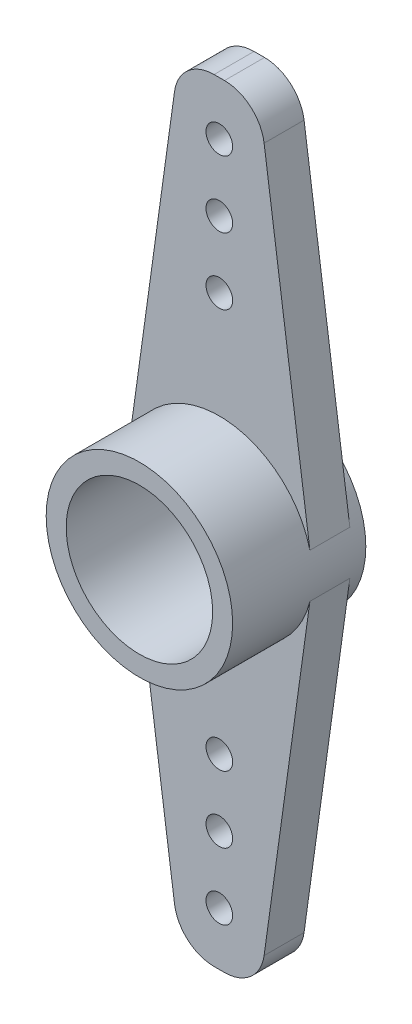
ISO-10303-21;
HEADER;
FILE_DESCRIPTION(('STEP AP214'),'2;1');
FILE_NAME('part.step','',(''),(''),'','','');
FILE_SCHEMA(('AUTOMOTIVE_DESIGN { 1 0 10303 214 1 1 1 1 }'));
ENDSEC;
DATA;
#1=APPLICATION_CONTEXT('core data for automotive mechanical design processes');
#2=APPLICATION_PROTOCOL_DEFINITION('international standard','automotive_design',2000,#1);
#3=PRODUCT_CONTEXT('',#1,'mechanical');
#4=PRODUCT('Part','Part','',(#3));
#5=PRODUCT_RELATED_PRODUCT_CATEGORY('part','',(#4));
#6=PRODUCT_DEFINITION_FORMATION('','',#4);
#7=PRODUCT_DEFINITION_CONTEXT('part definition',#1,'design');
#8=PRODUCT_DEFINITION('design','',#6,#7);
#9=PRODUCT_DEFINITION_SHAPE('','',#8);
#10=(LENGTH_UNIT() NAMED_UNIT(*) SI_UNIT(.MILLI.,.METRE.));
#11=(NAMED_UNIT(*) PLANE_ANGLE_UNIT() SI_UNIT($,.RADIAN.));
#12=(NAMED_UNIT(*) SI_UNIT($,.STERADIAN.) SOLID_ANGLE_UNIT());
#13=UNCERTAINTY_MEASURE_WITH_UNIT(LENGTH_MEASURE(1.E-05),#10,'distance_accuracy_value','');
#14=(GEOMETRIC_REPRESENTATION_CONTEXT(3) GLOBAL_UNCERTAINTY_ASSIGNED_CONTEXT((#13)) GLOBAL_UNIT_ASSIGNED_CONTEXT((#10,
#11,#12)) REPRESENTATION_CONTEXT('',''));
#15=CARTESIAN_POINT('',(0.,0.,0.));
#16=DIRECTION('',(0.,0.,1.));
#17=DIRECTION('',(1.,0.,0.));
#18=AXIS2_PLACEMENT_3D('',#15,#16,#17);
#19=CARTESIAN_POINT('',(0.,0.,1.5));
#20=DIRECTION('',(0.,0.,-1.));
#21=DIRECTION('',(-1.,0.,0.));
#22=AXIS2_PLACEMENT_3D('',#19,#20,#21);
#23=CYLINDRICAL_SURFACE('',#22,1.5);
#24=CARTESIAN_POINT('',(0.,0.,0.));
#25=DIRECTION('',(0.,0.,1.));
#26=DIRECTION('',(1.,0.,0.));
#27=AXIS2_PLACEMENT_3D('',#24,#25,#26);
#28=CIRCLE('',#27,1.5);
#29=CARTESIAN_POINT('',(1.5,0.,0.));
#30=VERTEX_POINT('',#29);
#31=EDGE_CURVE('E147',#30,#30,#28,.T.);
#32=ORIENTED_EDGE('',*,*,#31,.F.);
#33=EDGE_LOOP('',(#32));
#34=FACE_BOUND('',#33,.T.);
#35=CARTESIAN_POINT('',(0.,0.,0.5));
#36=DIRECTION('',(0.,0.,1.));
#37=DIRECTION('',(1.,0.,0.));
#38=AXIS2_PLACEMENT_3D('',#35,#36,#37);
#39=CIRCLE('',#38,1.5);
#40=CARTESIAN_POINT('',(1.5,0.,0.5));
#41=VERTEX_POINT('',#40);
#42=EDGE_CURVE('E37',#41,#41,#39,.T.);
#43=ORIENTED_EDGE('',*,*,#42,.T.);
#44=EDGE_LOOP('',(#43));
#45=FACE_BOUND('',#44,.T.);
#46=ADVANCED_FACE('F33',(#34,#45),#23,.F.);
#47=CARTESIAN_POINT('',(0.,0.,0.));
#48=DIRECTION('',(0.,0.,1.));
#49=DIRECTION('',(1.,0.,0.));
#50=AXIS2_PLACEMENT_3D('',#47,#48,#49);
#51=PLANE('',#50);
#52=ORIENTED_EDGE('',*,*,#31,.T.);
#53=EDGE_LOOP('',(#52));
#54=FACE_BOUND('',#53,.T.);
#55=CARTESIAN_POINT('',(0.,0.,0.));
#56=DIRECTION('',(0.,0.,-1.));
#57=DIRECTION('',(-1.,0.,0.));
#58=AXIS2_PLACEMENT_3D('',#55,#56,#57);
#59=CIRCLE('',#58,3.25);
#60=CARTESIAN_POINT('',(-3.25,0.,0.));
#61=VERTEX_POINT('',#60);
#62=EDGE_CURVE('E213',#61,#61,#59,.T.);
#63=ORIENTED_EDGE('',*,*,#62,.T.);
#64=EDGE_LOOP('',(#63));
#65=FACE_BOUND('',#64,.T.);
#66=ADVANCED_FACE('F240',(#54,#65),#51,.F.);
#67=CARTESIAN_POINT('',(0.,0.,-0.5));
#68=DIRECTION('',(0.,0.,-1.));
#69=DIRECTION('',(-1.,0.,0.));
#70=AXIS2_PLACEMENT_3D('',#67,#68,#69);
#71=PLANE('',#70);
#72=CARTESIAN_POINT('',(0.,0.,-0.5));
#73=DIRECTION('',(0.,0.,-1.));
#74=DIRECTION('',(-1.,0.,0.));
#75=AXIS2_PLACEMENT_3D('',#72,#73,#74);
#76=CIRCLE('',#75,3.5);
#77=CARTESIAN_POINT('',(-3.5,0.,-0.5));
#78=VERTEX_POINT('',#77);
#79=EDGE_CURVE('E201',#78,#78,#76,.T.);
#80=ORIENTED_EDGE('',*,*,#79,.T.);
#81=EDGE_LOOP('',(#80));
#82=FACE_BOUND('',#81,.T.);
#83=CARTESIAN_POINT('',(0.,0.,-0.5));
#84=DIRECTION('',(0.,0.,-1.));
#85=DIRECTION('',(-1.,0.,0.));
#86=AXIS2_PLACEMENT_3D('',#83,#84,#85);
#87=CIRCLE('',#86,3.25);
#88=CARTESIAN_POINT('',(-3.25,0.,-0.5));
#89=VERTEX_POINT('',#88);
#90=EDGE_CURVE('E211',#89,#89,#87,.T.);
#91=ORIENTED_EDGE('',*,*,#90,.F.);
#92=EDGE_LOOP('',(#91));
#93=FACE_BOUND('',#92,.T.);
#94=ADVANCED_FACE('F246',(#82,#93),#71,.T.);
#95=CARTESIAN_POINT('',(0.,0.,-0.5));
#96=DIRECTION('',(0.,0.,1.));
#97=DIRECTION('',(1.,0.,0.));
#98=AXIS2_PLACEMENT_3D('',#95,#96,#97);
#99=CYLINDRICAL_SURFACE('',#98,3.25);
#100=ORIENTED_EDGE('',*,*,#90,.T.);
#101=EDGE_LOOP('',(#100));
#102=FACE_BOUND('',#101,.T.);
#103=ORIENTED_EDGE('',*,*,#62,.F.);
#104=EDGE_LOOP('',(#103));
#105=FACE_BOUND('',#104,.T.);
#106=ADVANCED_FACE('F391',(#102,#105),#99,.F.);
#107=CARTESIAN_POINT('',(0.,10.,1.5));
#108=DIRECTION('',(0.,0.,-1.));
#109=DIRECTION('',(-1.,0.,0.));
#110=AXIS2_PLACEMENT_3D('',#107,#108,#109);
#111=CYLINDRICAL_SURFACE('',#110,0.5);
#112=CARTESIAN_POINT('',(0.,10.,1.5));
#113=DIRECTION('',(0.,0.,1.));
#114=DIRECTION('',(1.,0.,0.));
#115=AXIS2_PLACEMENT_3D('',#112,#113,#114);
#116=CIRCLE('',#115,0.5);
#117=CARTESIAN_POINT('',(0.5,10.,1.5));
#118=VERTEX_POINT('',#117);
#119=EDGE_CURVE('E334',#118,#118,#116,.T.);
#120=ORIENTED_EDGE('',*,*,#119,.T.);
#121=EDGE_LOOP('',(#120));
#122=FACE_BOUND('',#121,.T.);
#123=CARTESIAN_POINT('',(0.,10.,0.));
#124=DIRECTION('',(0.,0.,1.));
#125=DIRECTION('',(1.,0.,0.));
#126=AXIS2_PLACEMENT_3D('',#123,#124,#125);
#127=CIRCLE('',#126,0.5);
#128=CARTESIAN_POINT('',(0.5,10.,0.));
#129=VERTEX_POINT('',#128);
#130=EDGE_CURVE('E335',#129,#129,#127,.T.);
#131=ORIENTED_EDGE('',*,*,#130,.F.);
#132=EDGE_LOOP('',(#131));
#133=FACE_BOUND('',#132,.T.);
#134=ADVANCED_FACE('F254',(#122,#133),#111,.F.);
#135=CARTESIAN_POINT('',(0.,12.5,1.5));
#136=DIRECTION('',(0.,0.,-1.));
#137=DIRECTION('',(-1.,0.,0.));
#138=AXIS2_PLACEMENT_3D('',#135,#136,#137);
#139=CYLINDRICAL_SURFACE('',#138,0.5);
#140=CARTESIAN_POINT('',(0.,12.5,1.5));
#141=DIRECTION('',(0.,0.,1.));
#142=DIRECTION('',(1.,0.,0.));
#143=AXIS2_PLACEMENT_3D('',#140,#141,#142);
#144=CIRCLE('',#143,0.5);
#145=CARTESIAN_POINT('',(0.5,12.5,1.5));
#146=VERTEX_POINT('',#145);
#147=EDGE_CURVE('E338',#146,#146,#144,.T.);
#148=ORIENTED_EDGE('',*,*,#147,.T.);
#149=EDGE_LOOP('',(#148));
#150=FACE_BOUND('',#149,.T.);
#151=CARTESIAN_POINT('',(0.,12.5,0.));
#152=DIRECTION('',(0.,0.,1.));
#153=DIRECTION('',(1.,0.,0.));
#154=AXIS2_PLACEMENT_3D('',#151,#152,#153);
#155=CIRCLE('',#154,0.5);
#156=CARTESIAN_POINT('',(0.5,12.5,0.));
#157=VERTEX_POINT('',#156);
#158=EDGE_CURVE('E341',#157,#157,#155,.T.);
#159=ORIENTED_EDGE('',*,*,#158,.F.);
#160=EDGE_LOOP('',(#159));
#161=FACE_BOUND('',#160,.T.);
#162=ADVANCED_FACE('F384',(#150,#161),#139,.F.);
#163=CARTESIAN_POINT('',(0.,7.5,1.5));
#164=DIRECTION('',(0.,0.,-1.));
#165=DIRECTION('',(-1.,0.,0.));
#166=AXIS2_PLACEMENT_3D('',#163,#164,#165);
#167=CYLINDRICAL_SURFACE('',#166,0.5);
#168=CARTESIAN_POINT('',(0.,7.5,1.5));
#169=DIRECTION('',(0.,0.,1.));
#170=DIRECTION('',(1.,0.,0.));
#171=AXIS2_PLACEMENT_3D('',#168,#169,#170);
#172=CIRCLE('',#171,0.5);
#173=CARTESIAN_POINT('',(0.5,7.5,1.5));
#174=VERTEX_POINT('',#173);
#175=EDGE_CURVE('E344',#174,#174,#172,.T.);
#176=ORIENTED_EDGE('',*,*,#175,.T.);
#177=EDGE_LOOP('',(#176));
#178=FACE_BOUND('',#177,.T.);
#179=CARTESIAN_POINT('',(0.,7.5,0.));
#180=DIRECTION('',(0.,0.,1.));
#181=DIRECTION('',(1.,0.,0.));
#182=AXIS2_PLACEMENT_3D('',#179,#180,#181);
#183=CIRCLE('',#182,0.5);
#184=CARTESIAN_POINT('',(0.5,7.5,0.));
#185=VERTEX_POINT('',#184);
#186=EDGE_CURVE('E347',#185,#185,#183,.T.);
#187=ORIENTED_EDGE('',*,*,#186,.F.);
#188=EDGE_LOOP('',(#187));
#189=FACE_BOUND('',#188,.T.);
#190=ADVANCED_FACE('F274',(#178,#189),#167,.F.);
#191=CARTESIAN_POINT('',(0.196011828683711,13.,1.5));
#192=DIRECTION('',(0.,0.,-1.));
#193=DIRECTION('',(-1.,0.,0.));
#194=AXIS2_PLACEMENT_3D('',#191,#192,#193);
#195=CYLINDRICAL_SURFACE('',#194,1.5);
#196=CARTESIAN_POINT('',(0.196011828683711,13.,0.));
#197=DIRECTION('',(0.,0.,1.));
#198=DIRECTION('',(1.,0.,0.));
#199=AXIS2_PLACEMENT_3D('',#196,#197,#198);
#200=CIRCLE('',#199,1.5);
#201=CARTESIAN_POINT('',(1.68175998809153,13.206282347321,0.));
#202=VERTEX_POINT('',#201);
#203=CARTESIAN_POINT('',(0.196011828683702,14.5,0.));
#204=VERTEX_POINT('',#203);
#205=EDGE_CURVE('E158',#202,#204,#200,.T.);
#206=ORIENTED_EDGE('',*,*,#205,.T.);
#207=DIRECTION('',(0.,0.,-1.));
#208=VECTOR('',#207,1.);
#209=CARTESIAN_POINT('',(0.196011828683702,14.5,1.5));
#210=LINE('',#209,#208);
#211=CARTESIAN_POINT('',(0.196011828683702,14.5,1.5));
#212=VERTEX_POINT('',#211);
#213=EDGE_CURVE('E135',#212,#204,#210,.T.);
#214=ORIENTED_EDGE('',*,*,#213,.F.);
#215=CARTESIAN_POINT('',(0.196011828683711,13.,1.5));
#216=DIRECTION('',(0.,0.,1.));
#217=DIRECTION('',(1.,0.,0.));
#218=AXIS2_PLACEMENT_3D('',#215,#216,#217);
#219=CIRCLE('',#218,1.5);
#220=CARTESIAN_POINT('',(1.68175998809153,13.206282347321,1.5));
#221=VERTEX_POINT('',#220);
#222=EDGE_CURVE('E130',#221,#212,#219,.T.);
#223=ORIENTED_EDGE('',*,*,#222,.F.);
#224=DIRECTION('',(0.,0.,-1.));
#225=VECTOR('',#224,1.);
#226=CARTESIAN_POINT('',(1.68175998809153,13.206282347321,1.5));
#227=LINE('',#226,#225);
#228=EDGE_CURVE('E170',#221,#202,#227,.T.);
#229=ORIENTED_EDGE('',*,*,#228,.T.);
#230=EDGE_LOOP('',(#206,#214,#223,#229));
#231=FACE_BOUND('',#230,.T.);
#232=ADVANCED_FACE('F271',(#231),#195,.T.);
#233=CARTESIAN_POINT('',(-0.196011828683702,14.5,1.5));
#234=DIRECTION('',(0.,-1.,0.));
#235=DIRECTION('',(0.,0.,-1.));
#236=AXIS2_PLACEMENT_3D('',#233,#234,#235);
#237=PLANE('',#236);
#238=DIRECTION('',(-1.,0.,0.));
#239=VECTOR('',#238,1.);
#240=CARTESIAN_POINT('',(-0.196011828683702,14.5,0.));
#241=LINE('',#240,#239);
#242=CARTESIAN_POINT('',(-0.196011828683702,14.5,0.));
#243=VERTEX_POINT('',#242);
#244=EDGE_CURVE('E85',#204,#243,#241,.T.);
#245=ORIENTED_EDGE('',*,*,#244,.T.);
#246=DIRECTION('',(0.,0.,-1.));
#247=VECTOR('',#246,1.);
#248=CARTESIAN_POINT('',(-0.196011828683702,14.5,1.5));
#249=LINE('',#248,#247);
#250=CARTESIAN_POINT('',(-0.196011828683702,14.5,1.5));
#251=VERTEX_POINT('',#250);
#252=EDGE_CURVE('E133',#251,#243,#249,.T.);
#253=ORIENTED_EDGE('',*,*,#252,.F.);
#254=DIRECTION('',(-1.,0.,0.));
#255=VECTOR('',#254,1.);
#256=CARTESIAN_POINT('',(-0.196011828683702,14.5,1.5));
#257=LINE('',#256,#255);
#258=EDGE_CURVE('E124',#212,#251,#257,.T.);
#259=ORIENTED_EDGE('',*,*,#258,.F.);
#260=ORIENTED_EDGE('',*,*,#213,.T.);
#261=EDGE_LOOP('',(#245,#253,#259,#260));
#262=FACE_BOUND('',#261,.T.);
#263=ADVANCED_FACE('F134',(#262),#237,.F.);
#264=CARTESIAN_POINT('',(-0.196011828683711,13.,1.5));
#265=DIRECTION('',(0.,0.,-1.));
#266=DIRECTION('',(-1.,0.,0.));
#267=AXIS2_PLACEMENT_3D('',#264,#265,#266);
#268=CYLINDRICAL_SURFACE('',#267,1.5);
#269=CARTESIAN_POINT('',(-0.196011828683711,13.,0.));
#270=DIRECTION('',(0.,0.,1.));
#271=DIRECTION('',(1.,0.,0.));
#272=AXIS2_PLACEMENT_3D('',#269,#270,#271);
#273=CIRCLE('',#272,1.5);
#274=CARTESIAN_POINT('',(-1.68175998809153,13.206282347321,0.));
#275=VERTEX_POINT('',#274);
#276=EDGE_CURVE('E92',#243,#275,#273,.T.);
#277=ORIENTED_EDGE('',*,*,#276,.T.);
#278=DIRECTION('',(0.,0.,-1.));
#279=VECTOR('',#278,1.);
#280=CARTESIAN_POINT('',(-1.68175998809153,13.206282347321,1.5));
#281=LINE('',#280,#279);
#282=CARTESIAN_POINT('',(-1.68175998809153,13.206282347321,1.5));
#283=VERTEX_POINT('',#282);
#284=EDGE_CURVE('E136',#283,#275,#281,.T.);
#285=ORIENTED_EDGE('',*,*,#284,.F.);
#286=CARTESIAN_POINT('',(-0.196011828683711,13.,1.5));
#287=DIRECTION('',(0.,0.,1.));
#288=DIRECTION('',(1.,0.,0.));
#289=AXIS2_PLACEMENT_3D('',#286,#287,#288);
#290=CIRCLE('',#289,1.5);
#291=EDGE_CURVE('E128',#251,#283,#290,.T.);
#292=ORIENTED_EDGE('',*,*,#291,.F.);
#293=ORIENTED_EDGE('',*,*,#252,.T.);
#294=EDGE_LOOP('',(#277,#285,#292,#293));
#295=FACE_BOUND('',#294,.T.);
#296=ADVANCED_FACE('F138',(#295),#268,.T.);
#297=CARTESIAN_POINT('',(0.,-10.,1.5));
#298=DIRECTION('',(0.,0.,-1.));
#299=DIRECTION('',(-1.,0.,0.));
#300=AXIS2_PLACEMENT_3D('',#297,#298,#299);
#301=CYLINDRICAL_SURFACE('',#300,0.500000000000001);
#302=CARTESIAN_POINT('',(0.,-10.,1.5));
#303=DIRECTION('',(0.,0.,1.));
#304=DIRECTION('',(-1.,0.,0.));
#305=AXIS2_PLACEMENT_3D('',#302,#303,#304);
#306=CIRCLE('',#305,0.500000000000001);
#307=CARTESIAN_POINT('',(-0.499999999999931,-10.,1.5));
#308=VERTEX_POINT('',#307);
#309=EDGE_CURVE('E362',#308,#308,#306,.T.);
#310=ORIENTED_EDGE('',*,*,#309,.T.);
#311=EDGE_LOOP('',(#310));
#312=FACE_BOUND('',#311,.T.);
#313=CARTESIAN_POINT('',(0.,-10.,0.));
#314=DIRECTION('',(0.,0.,1.));
#315=DIRECTION('',(-1.,0.,0.));
#316=AXIS2_PLACEMENT_3D('',#313,#314,#315);
#317=CIRCLE('',#316,0.500000000000001);
#318=CARTESIAN_POINT('',(-0.499999999999931,-10.,0.));
#319=VERTEX_POINT('',#318);
#320=EDGE_CURVE('E205',#319,#319,#317,.T.);
#321=ORIENTED_EDGE('',*,*,#320,.F.);
#322=EDGE_LOOP('',(#321));
#323=FACE_BOUND('',#322,.T.);
#324=ADVANCED_FACE('F268',(#312,#323),#301,.F.);
#325=CARTESIAN_POINT('',(0.,-12.5,1.5));
#326=DIRECTION('',(0.,0.,-1.));
#327=DIRECTION('',(-1.,0.,0.));
#328=AXIS2_PLACEMENT_3D('',#325,#326,#327);
#329=CYLINDRICAL_SURFACE('',#328,0.500000000000001);
#330=CARTESIAN_POINT('',(0.,-12.5,1.5));
#331=DIRECTION('',(0.,0.,1.));
#332=DIRECTION('',(-1.,0.,0.));
#333=AXIS2_PLACEMENT_3D('',#330,#331,#332);
#334=CIRCLE('',#333,0.500000000000001);
#335=CARTESIAN_POINT('',(-0.499999999999914,-12.5,1.5));
#336=VERTEX_POINT('',#335);
#337=EDGE_CURVE('E356',#336,#336,#334,.T.);
#338=ORIENTED_EDGE('',*,*,#337,.T.);
#339=EDGE_LOOP('',(#338));
#340=FACE_BOUND('',#339,.T.);
#341=CARTESIAN_POINT('',(0.,-12.5,0.));
#342=DIRECTION('',(0.,0.,1.));
#343=DIRECTION('',(-1.,0.,0.));
#344=AXIS2_PLACEMENT_3D('',#341,#342,#343);
#345=CIRCLE('',#344,0.500000000000001);
#346=CARTESIAN_POINT('',(-0.499999999999914,-12.5,0.));
#347=VERTEX_POINT('',#346);
#348=EDGE_CURVE('E359',#347,#347,#345,.T.);
#349=ORIENTED_EDGE('',*,*,#348,.F.);
#350=EDGE_LOOP('',(#349));
#351=FACE_BOUND('',#350,.T.);
#352=ADVANCED_FACE('F300',(#340,#351),#329,.F.);
#353=CARTESIAN_POINT('',(0.,-7.50000000000003,1.5));
#354=DIRECTION('',(0.,0.,-1.));
#355=DIRECTION('',(-1.,0.,0.));
#356=AXIS2_PLACEMENT_3D('',#353,#354,#355);
#357=CYLINDRICAL_SURFACE('',#356,0.500000000000001);
#358=CARTESIAN_POINT('',(0.,-7.50000000000003,1.5));
#359=DIRECTION('',(0.,0.,1.));
#360=DIRECTION('',(-1.,0.,0.));
#361=AXIS2_PLACEMENT_3D('',#358,#359,#360);
#362=CIRCLE('',#361,0.500000000000001);
#363=CARTESIAN_POINT('',(-0.499999999999949,-7.50000000000003,1.5));
#364=VERTEX_POINT('',#363);
#365=EDGE_CURVE('E350',#364,#364,#362,.T.);
#366=ORIENTED_EDGE('',*,*,#365,.T.);
#367=EDGE_LOOP('',(#366));
#368=FACE_BOUND('',#367,.T.);
#369=CARTESIAN_POINT('',(0.,-7.50000000000003,0.));
#370=DIRECTION('',(0.,0.,1.));
#371=DIRECTION('',(-1.,0.,0.));
#372=AXIS2_PLACEMENT_3D('',#369,#370,#371);
#373=CIRCLE('',#372,0.500000000000001);
#374=CARTESIAN_POINT('',(-0.499999999999949,-7.50000000000003,0.));
#375=VERTEX_POINT('',#374);
#376=EDGE_CURVE('E353',#375,#375,#373,.T.);
#377=ORIENTED_EDGE('',*,*,#376,.F.);
#378=EDGE_LOOP('',(#377));
#379=FACE_BOUND('',#378,.T.);
#380=ADVANCED_FACE('F295',(#368,#379),#357,.F.);
#381=CARTESIAN_POINT('',(-0.19601182868362,-13.,1.5));
#382=DIRECTION('',(0.,0.,-1.));
#383=DIRECTION('',(-1.,0.,0.));
#384=AXIS2_PLACEMENT_3D('',#381,#382,#383);
#385=CYLINDRICAL_SURFACE('',#384,1.50000000000004);
#386=CARTESIAN_POINT('',(-0.19601182868362,-13.,0.));
#387=DIRECTION('',(0.,0.,1.));
#388=DIRECTION('',(-1.,0.,0.));
#389=AXIS2_PLACEMENT_3D('',#386,#387,#388);
#390=CIRCLE('',#389,1.50000000000004);
#391=CARTESIAN_POINT('',(-1.68175998809149,-13.206282347321,0.));
#392=VERTEX_POINT('',#391);
#393=CARTESIAN_POINT('',(-0.1960118286836,-14.5,0.));
#394=VERTEX_POINT('',#393);
#395=EDGE_CURVE('E146',#392,#394,#390,.T.);
#396=ORIENTED_EDGE('',*,*,#395,.T.);
#397=DIRECTION('',(0.,0.,-1.));
#398=VECTOR('',#397,1.);
#399=CARTESIAN_POINT('',(-0.1960118286836,-14.5,1.5));
#400=LINE('',#399,#398);
#401=CARTESIAN_POINT('',(-0.1960118286836,-14.5,1.5));
#402=VERTEX_POINT('',#401);
#403=EDGE_CURVE('E185',#402,#394,#400,.T.);
#404=ORIENTED_EDGE('',*,*,#403,.F.);
#405=CARTESIAN_POINT('',(-0.19601182868362,-13.,1.5));
#406=DIRECTION('',(0.,0.,1.));
#407=DIRECTION('',(-1.,0.,0.));
#408=AXIS2_PLACEMENT_3D('',#405,#406,#407);
#409=CIRCLE('',#408,1.50000000000004);
#410=CARTESIAN_POINT('',(-1.68175998809149,-13.206282347321,1.5));
#411=VERTEX_POINT('',#410);
#412=EDGE_CURVE('E329',#411,#402,#409,.T.);
#413=ORIENTED_EDGE('',*,*,#412,.F.);
#414=DIRECTION('',(0.,0.,-1.));
#415=VECTOR('',#414,1.);
#416=CARTESIAN_POINT('',(-1.68175998809149,-13.206282347321,1.5));
#417=LINE('',#416,#415);
#418=EDGE_CURVE('E188',#411,#392,#417,.T.);
#419=ORIENTED_EDGE('',*,*,#418,.T.);
#420=EDGE_LOOP('',(#396,#404,#413,#419));
#421=FACE_BOUND('',#420,.T.);
#422=ADVANCED_FACE('F292',(#421),#385,.T.);
#423=CARTESIAN_POINT('',(-0.1960118286836,-14.5,1.5));
#424=DIRECTION('',(0.,1.,0.));
#425=DIRECTION('',(0.,0.,1.));
#426=AXIS2_PLACEMENT_3D('',#423,#424,#425);
#427=PLANE('',#426);
#428=DIRECTION('',(1.,0.,0.));
#429=VECTOR('',#428,1.);
#430=CARTESIAN_POINT('',(-0.1960118286836,-14.5,0.));
#431=LINE('',#430,#429);
#432=CARTESIAN_POINT('',(0.196011828683802,-14.5,0.));
#433=VERTEX_POINT('',#432);
#434=EDGE_CURVE('E149',#394,#433,#431,.T.);
#435=ORIENTED_EDGE('',*,*,#434,.T.);
#436=DIRECTION('',(0.,0.,-1.));
#437=VECTOR('',#436,1.);
#438=CARTESIAN_POINT('',(0.196011828683802,-14.5,1.5));
#439=LINE('',#438,#437);
#440=CARTESIAN_POINT('',(0.196011828683802,-14.5,1.5));
#441=VERTEX_POINT('',#440);
#442=EDGE_CURVE('E182',#441,#433,#439,.T.);
#443=ORIENTED_EDGE('',*,*,#442,.F.);
#444=DIRECTION('',(1.,0.,0.));
#445=VECTOR('',#444,1.);
#446=CARTESIAN_POINT('',(-0.1960118286836,-14.5,1.5));
#447=LINE('',#446,#445);
#448=EDGE_CURVE('E311',#402,#441,#447,.T.);
#449=ORIENTED_EDGE('',*,*,#448,.F.);
#450=ORIENTED_EDGE('',*,*,#403,.T.);
#451=EDGE_LOOP('',(#435,#443,#449,#450));
#452=FACE_BOUND('',#451,.T.);
#453=ADVANCED_FACE('F289',(#452),#427,.F.);
#454=CARTESIAN_POINT('',(0.196011828683801,-13.,1.5));
#455=DIRECTION('',(0.,0.,-1.));
#456=DIRECTION('',(-1.,0.,0.));
#457=AXIS2_PLACEMENT_3D('',#454,#455,#456);
#458=CYLINDRICAL_SURFACE('',#457,1.49999999999995);
#459=CARTESIAN_POINT('',(0.196011828683801,-13.,0.));
#460=DIRECTION('',(0.,0.,1.));
#461=DIRECTION('',(-1.,0.,0.));
#462=AXIS2_PLACEMENT_3D('',#459,#460,#461);
#463=CIRCLE('',#462,1.49999999999995);
#464=CARTESIAN_POINT('',(1.68175998809153,-13.206282347321,0.));
#465=VERTEX_POINT('',#464);
#466=EDGE_CURVE('E151',#433,#465,#463,.T.);
#467=ORIENTED_EDGE('',*,*,#466,.T.);
#468=DIRECTION('',(0.,0.,-1.));
#469=VECTOR('',#468,1.);
#470=CARTESIAN_POINT('',(1.68175998809153,-13.206282347321,1.5));
#471=LINE('',#470,#469);
#472=CARTESIAN_POINT('',(1.68175998809153,-13.206282347321,1.5));
#473=VERTEX_POINT('',#472);
#474=EDGE_CURVE('E179',#473,#465,#471,.T.);
#475=ORIENTED_EDGE('',*,*,#474,.F.);
#476=CARTESIAN_POINT('',(0.196011828683801,-13.,1.5));
#477=DIRECTION('',(0.,0.,1.));
#478=DIRECTION('',(-1.,0.,0.));
#479=AXIS2_PLACEMENT_3D('',#476,#477,#478);
#480=CIRCLE('',#479,1.49999999999995);
#481=EDGE_CURVE('E323',#441,#473,#480,.T.);
#482=ORIENTED_EDGE('',*,*,#481,.F.);
#483=ORIENTED_EDGE('',*,*,#442,.T.);
#484=EDGE_LOOP('',(#467,#475,#482,#483));
#485=FACE_BOUND('',#484,.T.);
#486=ADVANCED_FACE('F286',(#485),#458,.T.);
#487=CARTESIAN_POINT('',(0.,0.,4.5));
#488=DIRECTION('',(0.,0.,1.));
#489=DIRECTION('',(1.,0.,0.));
#490=AXIS2_PLACEMENT_3D('',#487,#488,#489);
#491=PLANE('',#490);
#492=CARTESIAN_POINT('',(0.,0.,4.5));
#493=DIRECTION('',(0.,0.,1.));
#494=DIRECTION('',(1.,0.,0.));
#495=AXIS2_PLACEMENT_3D('',#492,#493,#494);
#496=CIRCLE('',#495,2.75);
#497=CARTESIAN_POINT('',(2.75,0.,4.5));
#498=VERTEX_POINT('',#497);
#499=EDGE_CURVE('E218',#498,#498,#496,.T.);
#500=ORIENTED_EDGE('',*,*,#499,.F.);
#501=EDGE_LOOP('',(#500));
#502=FACE_BOUND('',#501,.T.);
#503=CARTESIAN_POINT('',(0.,0.,4.5));
#504=DIRECTION('',(0.,0.,1.));
#505=DIRECTION('',(1.,0.,0.));
#506=AXIS2_PLACEMENT_3D('',#503,#504,#505);
#507=CIRCLE('',#506,3.5);
#508=CARTESIAN_POINT('',(3.5,0.,4.5));
#509=VERTEX_POINT('',#508);
#510=EDGE_CURVE('E200',#509,#509,#507,.T.);
#511=ORIENTED_EDGE('',*,*,#510,.T.);
#512=EDGE_LOOP('',(#511));
#513=FACE_BOUND('',#512,.T.);
#514=ADVANCED_FACE('F284',(#502,#513),#491,.T.);
#515=CARTESIAN_POINT('',(3.4,-0.830662386291809,1.5));
#516=DIRECTION('',(-0.990498772938549,0.137521564880675,0.));
#517=DIRECTION('',(-0.137521564880675,-0.990498772938549,0.));
#518=AXIS2_PLACEMENT_3D('',#515,#516,#517);
#519=PLANE('',#518);
#520=DIRECTION('',(0.137521564880675,0.990498772938548,0.));
#521=VECTOR('',#520,1.);
#522=CARTESIAN_POINT('',(3.4,-0.830662386291809,0.));
#523=LINE('',#522,#521);
#524=CARTESIAN_POINT('',(3.4,-0.83066238629181,0.));
#525=VERTEX_POINT('',#524);
#526=EDGE_CURVE('E153',#465,#525,#523,.T.);
#527=ORIENTED_EDGE('',*,*,#526,.T.);
#528=DIRECTION('',(0.,0.,-1.));
#529=VECTOR('',#528,1.);
#530=CARTESIAN_POINT('',(3.4,-0.83066238629181,1.5));
#531=LINE('',#530,#529);
#532=CARTESIAN_POINT('',(3.4,-0.83066238629181,1.5));
#533=VERTEX_POINT('',#532);
#534=EDGE_CURVE('E176',#533,#525,#531,.T.);
#535=ORIENTED_EDGE('',*,*,#534,.F.);
#536=DIRECTION('',(0.137521564880675,0.990498772938548,0.));
#537=VECTOR('',#536,1.);
#538=CARTESIAN_POINT('',(3.4,-0.830662386291809,1.5));
#539=LINE('',#538,#537);
#540=EDGE_CURVE('E321',#473,#533,#539,.T.);
#541=ORIENTED_EDGE('',*,*,#540,.F.);
#542=ORIENTED_EDGE('',*,*,#474,.T.);
#543=EDGE_LOOP('',(#527,#535,#541,#542));
#544=FACE_BOUND('',#543,.T.);
#545=ADVANCED_FACE('F258',(#544),#519,.F.);
#546=CARTESIAN_POINT('',(0.,0.,1.5));
#547=DIRECTION('',(0.,0.,1.));
#548=DIRECTION('',(1.,0.,0.));
#549=AXIS2_PLACEMENT_3D('',#546,#547,#548);
#550=PLANE('',#549);
#551=CARTESIAN_POINT('',(0.,0.,1.5));
#552=DIRECTION('',(0.,0.,1.));
#553=DIRECTION('',(1.,0.,0.));
#554=AXIS2_PLACEMENT_3D('',#551,#552,#553);
#555=CIRCLE('',#554,3.5);
#556=CARTESIAN_POINT('',(-3.4,-0.830662386291809,1.5));
#557=VERTEX_POINT('',#556);
#558=EDGE_CURVE('E43',#557,#533,#555,.T.);
#559=ORIENTED_EDGE('',*,*,#558,.F.);
#560=DIRECTION('',(0.137521564880675,-0.990498772938548,0.));
#561=VECTOR('',#560,1.);
#562=CARTESIAN_POINT('',(-3.4,-0.830662386291809,1.5));
#563=LINE('',#562,#561);
#564=EDGE_CURVE('E165',#557,#411,#563,.T.);
#565=ORIENTED_EDGE('',*,*,#564,.T.);
#566=ORIENTED_EDGE('',*,*,#412,.T.);
#567=ORIENTED_EDGE('',*,*,#448,.T.);
#568=ORIENTED_EDGE('',*,*,#481,.T.);
#569=ORIENTED_EDGE('',*,*,#540,.T.);
#570=EDGE_LOOP('',(#559,#565,#566,#567,#568,#569));
#571=FACE_BOUND('',#570,.T.);
#572=ORIENTED_EDGE('',*,*,#337,.F.);
#573=EDGE_LOOP('',(#572));
#574=FACE_BOUND('',#573,.T.);
#575=ORIENTED_EDGE('',*,*,#365,.F.);
#576=EDGE_LOOP('',(#575));
#577=FACE_BOUND('',#576,.T.);
#578=ORIENTED_EDGE('',*,*,#309,.F.);
#579=EDGE_LOOP('',(#578));
#580=FACE_BOUND('',#579,.T.);
#581=ADVANCED_FACE('F256',(#571,#574,#577,#580),#550,.T.);
#582=CARTESIAN_POINT('',(0.,0.,0.));
#583=DIRECTION('',(0.,0.,-1.));
#584=DIRECTION('',(-1.,0.,0.));
#585=AXIS2_PLACEMENT_3D('',#582,#583,#584);
#586=CIRCLE('',#585,3.5);
#587=CARTESIAN_POINT('',(-3.4,-0.830662386291809,0.));
#588=VERTEX_POINT('',#587);
#589=EDGE_CURVE('E11',#525,#588,#586,.T.);
#590=ORIENTED_EDGE('',*,*,#589,.F.);
#591=ORIENTED_EDGE('',*,*,#526,.F.);
#592=ORIENTED_EDGE('',*,*,#466,.F.);
#593=ORIENTED_EDGE('',*,*,#434,.F.);
#594=ORIENTED_EDGE('',*,*,#395,.F.);
#595=DIRECTION('',(0.137521564880675,-0.990498772938548,0.));
#596=VECTOR('',#595,1.);
#597=CARTESIAN_POINT('',(-3.4,-0.830662386291809,0.));
#598=LINE('',#597,#596);
#599=EDGE_CURVE('E144',#588,#392,#598,.T.);
#600=ORIENTED_EDGE('',*,*,#599,.F.);
#601=EDGE_LOOP('',(#590,#591,#592,#593,#594,#600));
#602=FACE_BOUND('',#601,.T.);
#603=ORIENTED_EDGE('',*,*,#376,.T.);
#604=EDGE_LOOP('',(#603));
#605=FACE_BOUND('',#604,.T.);
#606=ORIENTED_EDGE('',*,*,#348,.T.);
#607=EDGE_LOOP('',(#606));
#608=FACE_BOUND('',#607,.T.);
#609=ORIENTED_EDGE('',*,*,#320,.T.);
#610=EDGE_LOOP('',(#609));
#611=FACE_BOUND('',#610,.T.);
#612=ADVANCED_FACE('F249',(#602,#605,#608,#611),#51,.F.);
#613=CARTESIAN_POINT('',(-3.4,-0.830662386291809,1.5));
#614=DIRECTION('',(0.990498772938549,0.137521564880675,0.));
#615=DIRECTION('',(-0.137521564880675,0.990498772938549,0.));
#616=AXIS2_PLACEMENT_3D('',#613,#614,#615);
#617=PLANE('',#616);
#618=ORIENTED_EDGE('',*,*,#599,.T.);
#619=ORIENTED_EDGE('',*,*,#418,.F.);
#620=ORIENTED_EDGE('',*,*,#564,.F.);
#621=DIRECTION('',(0.,0.,-1.));
#622=VECTOR('',#621,1.);
#623=CARTESIAN_POINT('',(-3.4,-0.830662386291809,1.5));
#624=LINE('',#623,#622);
#625=EDGE_CURVE('E190',#557,#588,#624,.T.);
#626=ORIENTED_EDGE('',*,*,#625,.T.);
#627=EDGE_LOOP('',(#618,#619,#620,#626));
#628=FACE_BOUND('',#627,.T.);
#629=ADVANCED_FACE('F35',(#628),#617,.F.);
#630=CARTESIAN_POINT('',(-3.4,0.830662386291809,1.5));
#631=DIRECTION('',(0.990498772938549,-0.137521564880675,0.));
#632=DIRECTION('',(0.137521564880675,0.990498772938549,0.));
#633=AXIS2_PLACEMENT_3D('',#630,#631,#632);
#634=PLANE('',#633);
#635=DIRECTION('',(-0.137521564880675,-0.990498772938548,0.));
#636=VECTOR('',#635,1.);
#637=CARTESIAN_POINT('',(-3.4,0.830662386291809,0.));
#638=LINE('',#637,#636);
#639=CARTESIAN_POINT('',(-3.4,0.830662386291809,0.));
#640=VERTEX_POINT('',#639);
#641=EDGE_CURVE('E162',#275,#640,#638,.T.);
#642=ORIENTED_EDGE('',*,*,#641,.T.);
#643=DIRECTION('',(0.,0.,-1.));
#644=VECTOR('',#643,1.);
#645=CARTESIAN_POINT('',(-3.4,0.830662386291809,1.5));
#646=LINE('',#645,#644);
#647=CARTESIAN_POINT('',(-3.4,0.830662386291809,1.5));
#648=VERTEX_POINT('',#647);
#649=EDGE_CURVE('E140',#648,#640,#646,.T.);
#650=ORIENTED_EDGE('',*,*,#649,.F.);
#651=DIRECTION('',(-0.137521564880675,-0.990498772938548,0.));
#652=VECTOR('',#651,1.);
#653=CARTESIAN_POINT('',(-3.4,0.830662386291809,1.5));
#654=LINE('',#653,#652);
#655=EDGE_CURVE('E53',#283,#648,#654,.T.);
#656=ORIENTED_EDGE('',*,*,#655,.F.);
#657=ORIENTED_EDGE('',*,*,#284,.T.);
#658=EDGE_LOOP('',(#642,#650,#656,#657));
#659=FACE_BOUND('',#658,.T.);
#660=ADVANCED_FACE('F262',(#659),#634,.F.);
#661=CARTESIAN_POINT('',(3.4,0.830662386291809,1.5));
#662=VERTEX_POINT('',#661);
#663=EDGE_CURVE('E195',#662,#648,#555,.T.);
#664=ORIENTED_EDGE('',*,*,#663,.F.);
#665=DIRECTION('',(-0.137521564880675,0.990498772938548,0.));
#666=VECTOR('',#665,1.);
#667=CARTESIAN_POINT('',(3.4,0.830662386291809,1.5));
#668=LINE('',#667,#666);
#669=EDGE_CURVE('E322',#662,#221,#668,.T.);
#670=ORIENTED_EDGE('',*,*,#669,.T.);
#671=ORIENTED_EDGE('',*,*,#222,.T.);
#672=ORIENTED_EDGE('',*,*,#258,.T.);
#673=ORIENTED_EDGE('',*,*,#291,.T.);
#674=ORIENTED_EDGE('',*,*,#655,.T.);
#675=EDGE_LOOP('',(#664,#670,#671,#672,#673,#674));
#676=FACE_BOUND('',#675,.T.);
#677=ORIENTED_EDGE('',*,*,#147,.F.);
#678=EDGE_LOOP('',(#677));
#679=FACE_BOUND('',#678,.T.);
#680=ORIENTED_EDGE('',*,*,#119,.F.);
#681=EDGE_LOOP('',(#680));
#682=FACE_BOUND('',#681,.T.);
#683=ORIENTED_EDGE('',*,*,#175,.F.);
#684=EDGE_LOOP('',(#683));
#685=FACE_BOUND('',#684,.T.);
#686=ADVANCED_FACE('F125',(#676,#679,#682,#685),#550,.T.);
#687=CARTESIAN_POINT('',(3.4,0.830662386291812,0.));
#688=VERTEX_POINT('',#687);
#689=EDGE_CURVE('E45',#640,#688,#586,.T.);
#690=ORIENTED_EDGE('',*,*,#689,.F.);
#691=ORIENTED_EDGE('',*,*,#641,.F.);
#692=ORIENTED_EDGE('',*,*,#276,.F.);
#693=ORIENTED_EDGE('',*,*,#244,.F.);
#694=ORIENTED_EDGE('',*,*,#205,.F.);
#695=DIRECTION('',(-0.137521564880675,0.990498772938548,0.));
#696=VECTOR('',#695,1.);
#697=CARTESIAN_POINT('',(3.4,0.830662386291809,0.));
#698=LINE('',#697,#696);
#699=EDGE_CURVE('E156',#688,#202,#698,.T.);
#700=ORIENTED_EDGE('',*,*,#699,.F.);
#701=EDGE_LOOP('',(#690,#691,#692,#693,#694,#700));
#702=FACE_BOUND('',#701,.T.);
#703=ORIENTED_EDGE('',*,*,#186,.T.);
#704=EDGE_LOOP('',(#703));
#705=FACE_BOUND('',#704,.T.);
#706=ORIENTED_EDGE('',*,*,#158,.T.);
#707=EDGE_LOOP('',(#706));
#708=FACE_BOUND('',#707,.T.);
#709=ORIENTED_EDGE('',*,*,#130,.T.);
#710=EDGE_LOOP('',(#709));
#711=FACE_BOUND('',#710,.T.);
#712=ADVANCED_FACE('F250',(#702,#705,#708,#711),#51,.F.);
#713=CARTESIAN_POINT('',(3.4,0.830662386291809,1.5));
#714=DIRECTION('',(-0.990498772938549,-0.137521564880675,0.));
#715=DIRECTION('',(0.137521564880675,-0.990498772938549,0.));
#716=AXIS2_PLACEMENT_3D('',#713,#714,#715);
#717=PLANE('',#716);
#718=ORIENTED_EDGE('',*,*,#699,.T.);
#719=ORIENTED_EDGE('',*,*,#228,.F.);
#720=ORIENTED_EDGE('',*,*,#669,.F.);
#721=DIRECTION('',(0.,0.,-1.));
#722=VECTOR('',#721,1.);
#723=CARTESIAN_POINT('',(3.4,0.830662386291809,1.5));
#724=LINE('',#723,#722);
#725=EDGE_CURVE('E173',#662,#688,#724,.T.);
#726=ORIENTED_EDGE('',*,*,#725,.T.);
#727=EDGE_LOOP('',(#718,#719,#720,#726));
#728=FACE_BOUND('',#727,.T.);
#729=ADVANCED_FACE('F276',(#728),#717,.F.);
#730=CARTESIAN_POINT('',(0.,0.,1.5));
#731=DIRECTION('',(0.,0.,-1.));
#732=DIRECTION('',(-1.,0.,0.));
#733=AXIS2_PLACEMENT_3D('',#730,#731,#732);
#734=CYLINDRICAL_SURFACE('',#733,3.5);
#735=ORIENTED_EDGE('',*,*,#689,.T.);
#736=ORIENTED_EDGE('',*,*,#725,.F.);
#737=ORIENTED_EDGE('',*,*,#663,.T.);
#738=ORIENTED_EDGE('',*,*,#649,.T.);
#739=EDGE_LOOP('',(#735,#736,#737,#738));
#740=FACE_BOUND('',#739,.T.);
#741=ORIENTED_EDGE('',*,*,#534,.T.);
#742=ORIENTED_EDGE('',*,*,#589,.T.);
#743=ORIENTED_EDGE('',*,*,#625,.F.);
#744=ORIENTED_EDGE('',*,*,#558,.T.);
#745=EDGE_LOOP('',(#741,#742,#743,#744));
#746=FACE_BOUND('',#745,.T.);
#747=ORIENTED_EDGE('',*,*,#510,.F.);
#748=EDGE_LOOP('',(#747));
#749=FACE_BOUND('',#748,.T.);
#750=ORIENTED_EDGE('',*,*,#79,.F.);
#751=EDGE_LOOP('',(#750));
#752=FACE_BOUND('',#751,.T.);
#753=ADVANCED_FACE('F236',(#740,#746,#749,#752),#734,.T.);
#754=CARTESIAN_POINT('',(0.,0.,0.5));
#755=DIRECTION('',(0.,0.,1.));
#756=DIRECTION('',(1.,0.,0.));
#757=AXIS2_PLACEMENT_3D('',#754,#755,#756);
#758=CYLINDRICAL_SURFACE('',#757,2.75);
#759=CARTESIAN_POINT('',(0.,0.,0.5));
#760=DIRECTION('',(0.,0.,1.));
#761=DIRECTION('',(1.,0.,0.));
#762=AXIS2_PLACEMENT_3D('',#759,#760,#761);
#763=CIRCLE('',#762,2.75);
#764=CARTESIAN_POINT('',(2.75,0.,0.5));
#765=VERTEX_POINT('',#764);
#766=EDGE_CURVE('E221',#765,#765,#763,.T.);
#767=ORIENTED_EDGE('',*,*,#766,.F.);
#768=EDGE_LOOP('',(#767));
#769=FACE_BOUND('',#768,.T.);
#770=ORIENTED_EDGE('',*,*,#499,.T.);
#771=EDGE_LOOP('',(#770));
#772=FACE_BOUND('',#771,.T.);
#773=ADVANCED_FACE('F231',(#769,#772),#758,.F.);
#774=CARTESIAN_POINT('',(0.,0.,0.5));
#775=DIRECTION('',(0.,0.,1.));
#776=DIRECTION('',(1.,0.,0.));
#777=AXIS2_PLACEMENT_3D('',#774,#775,#776);
#778=PLANE('',#777);
#779=ORIENTED_EDGE('',*,*,#42,.F.);
#780=EDGE_LOOP('',(#779));
#781=FACE_BOUND('',#780,.T.);
#782=ORIENTED_EDGE('',*,*,#766,.T.);
#783=EDGE_LOOP('',(#782));
#784=FACE_BOUND('',#783,.T.);
#785=ADVANCED_FACE('F229',(#781,#784),#778,.T.);
#786=CLOSED_SHELL('',(#46,#66,#94,#106,#134,#162,#190,#232,#263,#296,#324,#352,#380,#422,#453,
#486,#514,#545,#581,#612,#629,#660,#686,#712,#729,#753,#773,#785));
#787=MANIFOLD_SOLID_BREP('B2',#786);
#788=ADVANCED_BREP_SHAPE_REPRESENTATION('',(#18,#787),#14);
#789=SHAPE_DEFINITION_REPRESENTATION(#9,#788);
ENDSEC;
END-ISO-10303-21;
